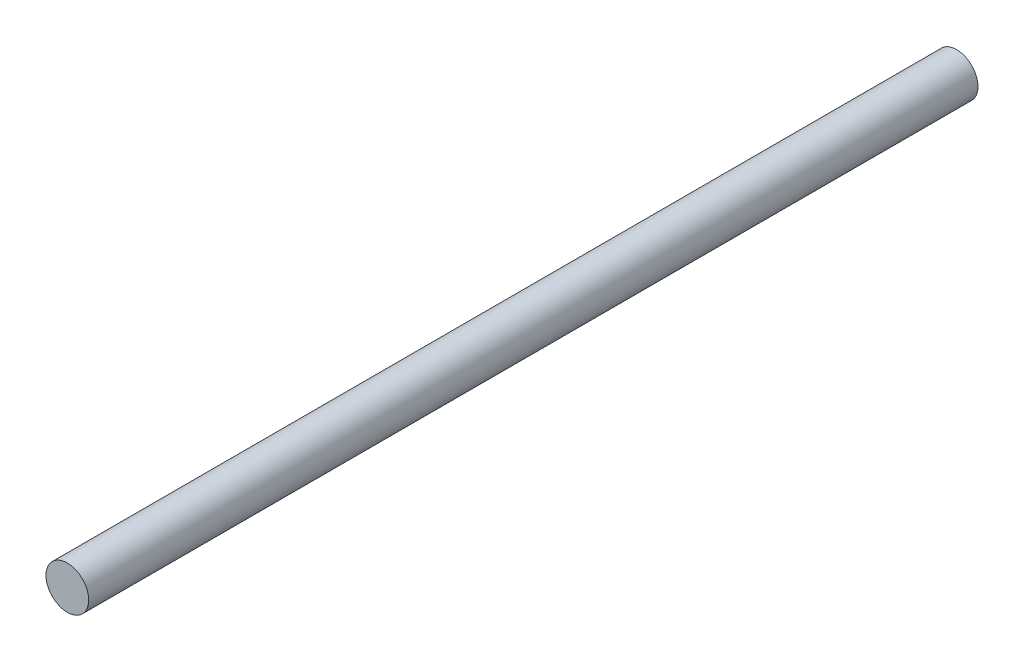
ISO-10303-21;
HEADER;
FILE_DESCRIPTION(('STEP AP214'),'2;1');
FILE_NAME('part.step','',(''),(''),'','','');
FILE_SCHEMA(('AUTOMOTIVE_DESIGN { 1 0 10303 214 1 1 1 1 }'));
ENDSEC;
DATA;
#1=APPLICATION_CONTEXT('core data for automotive mechanical design processes');
#2=APPLICATION_PROTOCOL_DEFINITION('international standard','automotive_design',2000,#1);
#3=PRODUCT_CONTEXT('',#1,'mechanical');
#4=PRODUCT('Part','Part','',(#3));
#5=PRODUCT_RELATED_PRODUCT_CATEGORY('part','',(#4));
#6=PRODUCT_DEFINITION_FORMATION('','',#4);
#7=PRODUCT_DEFINITION_CONTEXT('part definition',#1,'design');
#8=PRODUCT_DEFINITION('design','',#6,#7);
#9=PRODUCT_DEFINITION_SHAPE('','',#8);
#10=(LENGTH_UNIT() NAMED_UNIT(*) SI_UNIT(.MILLI.,.METRE.));
#11=(NAMED_UNIT(*) PLANE_ANGLE_UNIT() SI_UNIT($,.RADIAN.));
#12=(NAMED_UNIT(*) SI_UNIT($,.STERADIAN.) SOLID_ANGLE_UNIT());
#13=UNCERTAINTY_MEASURE_WITH_UNIT(LENGTH_MEASURE(1.E-05),#10,'distance_accuracy_value','');
#14=(GEOMETRIC_REPRESENTATION_CONTEXT(3) GLOBAL_UNCERTAINTY_ASSIGNED_CONTEXT((#13)) GLOBAL_UNIT_ASSIGNED_CONTEXT((#10,
#11,#12)) REPRESENTATION_CONTEXT('',''));
#15=CARTESIAN_POINT('',(0.,0.,0.));
#16=DIRECTION('',(0.,0.,1.));
#17=DIRECTION('',(1.,0.,0.));
#18=AXIS2_PLACEMENT_3D('',#15,#16,#17);
#19=CARTESIAN_POINT('',(0.,0.,165.1));
#20=DIRECTION('',(0.,0.,-1.));
#21=DIRECTION('',(-1.,0.,0.));
#22=AXIS2_PLACEMENT_3D('',#19,#20,#21);
#23=CYLINDRICAL_SURFACE('',#22,3.96875);
#24=CARTESIAN_POINT('',(0.,0.,165.1));
#25=DIRECTION('',(0.,0.,1.));
#26=DIRECTION('',(1.,0.,0.));
#27=AXIS2_PLACEMENT_3D('',#24,#25,#26);
#28=CIRCLE('',#27,3.96875);
#29=CARTESIAN_POINT('',(3.96875,0.,165.1));
#30=VERTEX_POINT('',#29);
#31=EDGE_CURVE('E10',#30,#30,#28,.T.);
#32=ORIENTED_EDGE('',*,*,#31,.F.);
#33=EDGE_LOOP('',(#32));
#34=FACE_BOUND('',#33,.T.);
#35=CARTESIAN_POINT('',(0.,0.,0.));
#36=DIRECTION('',(0.,0.,1.));
#37=DIRECTION('',(1.,0.,0.));
#38=AXIS2_PLACEMENT_3D('',#35,#36,#37);
#39=CIRCLE('',#38,3.96875);
#40=CARTESIAN_POINT('',(3.96875,0.,0.));
#41=VERTEX_POINT('',#40);
#42=EDGE_CURVE('E34',#41,#41,#39,.T.);
#43=ORIENTED_EDGE('',*,*,#42,.T.);
#44=EDGE_LOOP('',(#43));
#45=FACE_BOUND('',#44,.T.);
#46=ADVANCED_FACE('F31',(#34,#45),#23,.T.);
#47=CARTESIAN_POINT('',(0.,0.,165.1));
#48=DIRECTION('',(0.,0.,1.));
#49=DIRECTION('',(1.,0.,0.));
#50=AXIS2_PLACEMENT_3D('',#47,#48,#49);
#51=PLANE('',#50);
#52=ORIENTED_EDGE('',*,*,#31,.T.);
#53=EDGE_LOOP('',(#52));
#54=FACE_BOUND('',#53,.T.);
#55=ADVANCED_FACE('F46',(#54),#51,.T.);
#56=CARTESIAN_POINT('',(0.,0.,0.));
#57=DIRECTION('',(0.,0.,1.));
#58=DIRECTION('',(1.,0.,0.));
#59=AXIS2_PLACEMENT_3D('',#56,#57,#58);
#60=PLANE('',#59);
#61=ORIENTED_EDGE('',*,*,#42,.F.);
#62=EDGE_LOOP('',(#61));
#63=FACE_BOUND('',#62,.T.);
#64=ADVANCED_FACE('F44',(#63),#60,.F.);
#65=CLOSED_SHELL('',(#46,#55,#64));
#66=MANIFOLD_SOLID_BREP('B2',#65);
#67=ADVANCED_BREP_SHAPE_REPRESENTATION('',(#18,#66),#14);
#68=SHAPE_DEFINITION_REPRESENTATION(#9,#67);
ENDSEC;
END-ISO-10303-21;
